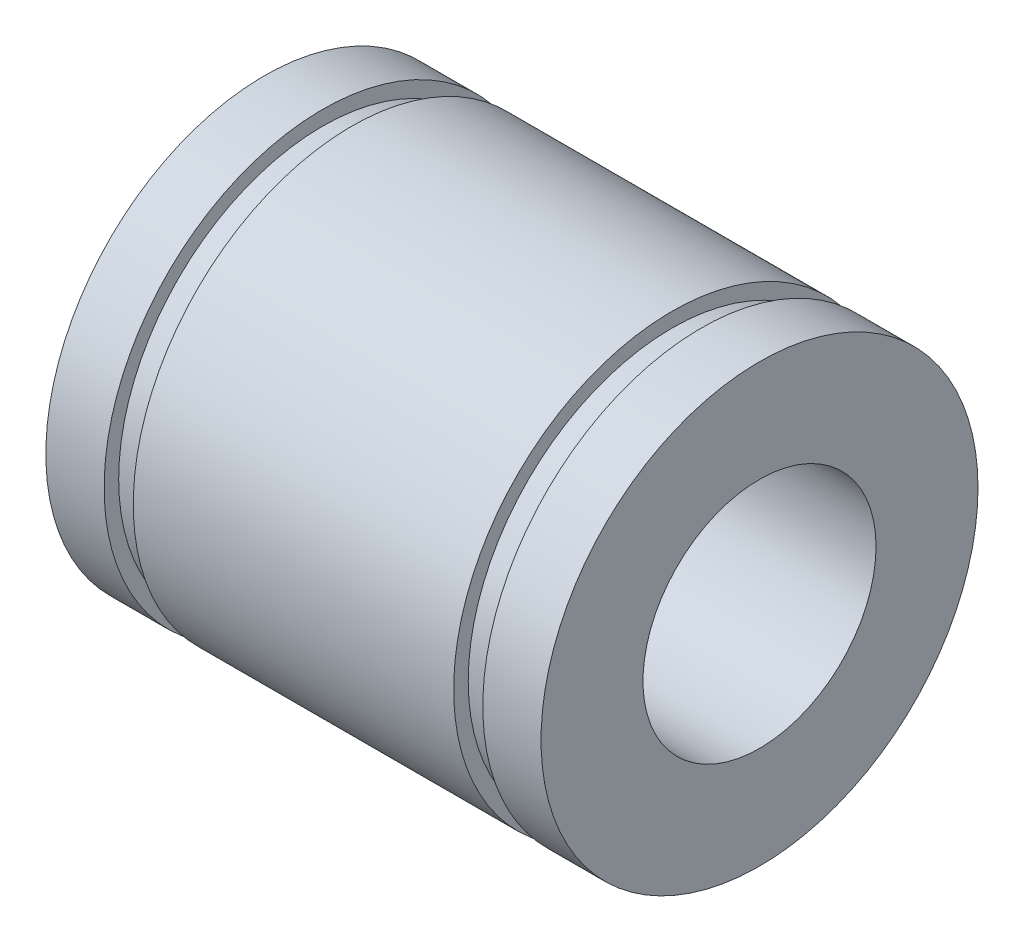
ISO-10303-21;
HEADER;
FILE_DESCRIPTION(('STEP AP214'),'2;1');
FILE_NAME('part.step','',(''),(''),'','','');
FILE_SCHEMA(('AUTOMOTIVE_DESIGN { 1 0 10303 214 1 1 1 1 }'));
ENDSEC;
DATA;
#1=APPLICATION_CONTEXT('core data for automotive mechanical design processes');
#2=APPLICATION_PROTOCOL_DEFINITION('international standard','automotive_design',2000,#1);
#3=PRODUCT_CONTEXT('',#1,'mechanical');
#4=PRODUCT('Part','Part','',(#3));
#5=PRODUCT_RELATED_PRODUCT_CATEGORY('part','',(#4));
#6=PRODUCT_DEFINITION_FORMATION('','',#4);
#7=PRODUCT_DEFINITION_CONTEXT('part definition',#1,'design');
#8=PRODUCT_DEFINITION('design','',#6,#7);
#9=PRODUCT_DEFINITION_SHAPE('','',#8);
#10=(LENGTH_UNIT() NAMED_UNIT(*) SI_UNIT(.MILLI.,.METRE.));
#11=(NAMED_UNIT(*) PLANE_ANGLE_UNIT() SI_UNIT($,.RADIAN.));
#12=(NAMED_UNIT(*) SI_UNIT($,.STERADIAN.) SOLID_ANGLE_UNIT());
#13=UNCERTAINTY_MEASURE_WITH_UNIT(LENGTH_MEASURE(1.E-05),#10,'distance_accuracy_value','');
#14=(GEOMETRIC_REPRESENTATION_CONTEXT(3) GLOBAL_UNCERTAINTY_ASSIGNED_CONTEXT((#13)) GLOBAL_UNIT_ASSIGNED_CONTEXT((#10,
#11,#12)) REPRESENTATION_CONTEXT('',''));
#15=CARTESIAN_POINT('',(0.,0.,0.));
#16=DIRECTION('',(0.,0.,1.));
#17=DIRECTION('',(1.,0.,0.));
#18=AXIS2_PLACEMENT_3D('',#15,#16,#17);
#19=CARTESIAN_POINT('',(14.,0.,0.));
#20=DIRECTION('',(1.,0.,0.));
#21=DIRECTION('',(0.,0.,-1.));
#22=AXIS2_PLACEMENT_3D('',#19,#20,#21);
#23=PLANE('',#22);
#24=CARTESIAN_POINT('',(14.,0.,0.));
#25=DIRECTION('',(1.,0.,0.));
#26=DIRECTION('',(0.,0.,-1.));
#27=AXIS2_PLACEMENT_3D('',#24,#25,#26);
#28=CIRCLE('',#27,7.5);
#29=CARTESIAN_POINT('',(14.,0.,-7.5));
#30=VERTEX_POINT('',#29);
#31=EDGE_CURVE('E49',#30,#30,#28,.T.);
#32=ORIENTED_EDGE('',*,*,#31,.T.);
#33=EDGE_LOOP('',(#32));
#34=FACE_BOUND('',#33,.T.);
#35=CARTESIAN_POINT('',(14.,0.,0.));
#36=DIRECTION('',(1.,0.,0.));
#37=DIRECTION('',(0.,0.,-1.));
#38=AXIS2_PLACEMENT_3D('',#35,#36,#37);
#39=CIRCLE('',#38,7.);
#40=CARTESIAN_POINT('',(14.,0.,-7.));
#41=VERTEX_POINT('',#40);
#42=EDGE_CURVE('E58',#41,#41,#39,.T.);
#43=ORIENTED_EDGE('',*,*,#42,.F.);
#44=EDGE_LOOP('',(#43));
#45=FACE_BOUND('',#44,.T.);
#46=ADVANCED_FACE('F30',(#34,#45),#23,.T.);
#47=CARTESIAN_POINT('',(2.,0.,0.));
#48=DIRECTION('',(1.,0.,0.));
#49=DIRECTION('',(0.,0.,-1.));
#50=AXIS2_PLACEMENT_3D('',#47,#48,#49);
#51=PLANE('',#50);
#52=CARTESIAN_POINT('',(2.,0.,0.));
#53=DIRECTION('',(1.,0.,0.));
#54=DIRECTION('',(0.,0.,-1.));
#55=AXIS2_PLACEMENT_3D('',#52,#53,#54);
#56=CIRCLE('',#55,7.5);
#57=CARTESIAN_POINT('',(2.,0.,-7.5));
#58=VERTEX_POINT('',#57);
#59=EDGE_CURVE('E10',#58,#58,#56,.T.);
#60=ORIENTED_EDGE('',*,*,#59,.T.);
#61=EDGE_LOOP('',(#60));
#62=FACE_BOUND('',#61,.T.);
#63=CARTESIAN_POINT('',(2.,0.,0.));
#64=DIRECTION('',(1.,0.,0.));
#65=DIRECTION('',(0.,0.,-1.));
#66=AXIS2_PLACEMENT_3D('',#63,#64,#65);
#67=CIRCLE('',#66,7.);
#68=CARTESIAN_POINT('',(2.,0.,-7.));
#69=VERTEX_POINT('',#68);
#70=EDGE_CURVE('E46',#69,#69,#67,.T.);
#71=ORIENTED_EDGE('',*,*,#70,.F.);
#72=EDGE_LOOP('',(#71));
#73=FACE_BOUND('',#72,.T.);
#74=ADVANCED_FACE('F91',(#62,#73),#51,.T.);
#75=CARTESIAN_POINT('',(0.,0.,0.));
#76=DIRECTION('',(1.,0.,0.));
#77=DIRECTION('',(0.,0.,-1.));
#78=AXIS2_PLACEMENT_3D('',#75,#76,#77);
#79=PLANE('',#78);
#80=CARTESIAN_POINT('',(0.,0.,0.));
#81=DIRECTION('',(1.,0.,0.));
#82=DIRECTION('',(0.,0.,-1.));
#83=AXIS2_PLACEMENT_3D('',#80,#81,#82);
#84=CIRCLE('',#83,7.5);
#85=CARTESIAN_POINT('',(0.,0.,-7.5));
#86=VERTEX_POINT('',#85);
#87=EDGE_CURVE('E34',#86,#86,#84,.T.);
#88=ORIENTED_EDGE('',*,*,#87,.F.);
#89=EDGE_LOOP('',(#88));
#90=FACE_BOUND('',#89,.T.);
#91=CARTESIAN_POINT('',(0.,0.,0.));
#92=DIRECTION('',(1.,0.,0.));
#93=DIRECTION('',(0.,0.,-1.));
#94=AXIS2_PLACEMENT_3D('',#91,#92,#93);
#95=CIRCLE('',#94,4.);
#96=CARTESIAN_POINT('',(0.,0.,-4.));
#97=VERTEX_POINT('',#96);
#98=EDGE_CURVE('E41',#97,#97,#95,.T.);
#99=ORIENTED_EDGE('',*,*,#98,.T.);
#100=EDGE_LOOP('',(#99));
#101=FACE_BOUND('',#100,.T.);
#102=ADVANCED_FACE('F97',(#90,#101),#79,.F.);
#103=CARTESIAN_POINT('',(2.,0.,0.));
#104=DIRECTION('',(-1.,0.,0.));
#105=DIRECTION('',(0.,0.,1.));
#106=AXIS2_PLACEMENT_3D('',#103,#104,#105);
#107=CYLINDRICAL_SURFACE('',#106,7.5);
#108=ORIENTED_EDGE('',*,*,#59,.F.);
#109=EDGE_LOOP('',(#108));
#110=FACE_BOUND('',#109,.T.);
#111=ORIENTED_EDGE('',*,*,#87,.T.);
#112=EDGE_LOOP('',(#111));
#113=FACE_BOUND('',#112,.T.);
#114=ADVANCED_FACE('F32',(#110,#113),#107,.T.);
#115=CARTESIAN_POINT('',(2.,0.,0.));
#116=DIRECTION('',(-1.,0.,0.));
#117=DIRECTION('',(0.,0.,1.));
#118=AXIS2_PLACEMENT_3D('',#115,#116,#117);
#119=CYLINDRICAL_SURFACE('',#118,4.);
#120=ORIENTED_EDGE('',*,*,#98,.F.);
#121=EDGE_LOOP('',(#120));
#122=FACE_BOUND('',#121,.T.);
#123=CARTESIAN_POINT('',(17.,0.,0.));
#124=DIRECTION('',(1.,0.,0.));
#125=DIRECTION('',(0.,0.,-1.));
#126=AXIS2_PLACEMENT_3D('',#123,#124,#125);
#127=CIRCLE('',#126,4.);
#128=CARTESIAN_POINT('',(17.,0.,-4.));
#129=VERTEX_POINT('',#128);
#130=EDGE_CURVE('E67',#129,#129,#127,.T.);
#131=ORIENTED_EDGE('',*,*,#130,.T.);
#132=EDGE_LOOP('',(#131));
#133=FACE_BOUND('',#132,.T.);
#134=ADVANCED_FACE('F73',(#122,#133),#119,.F.);
#135=CARTESIAN_POINT('',(3.,0.,0.));
#136=DIRECTION('',(-1.,0.,0.));
#137=DIRECTION('',(0.,0.,1.));
#138=AXIS2_PLACEMENT_3D('',#135,#136,#137);
#139=CYLINDRICAL_SURFACE('',#138,7.);
#140=CARTESIAN_POINT('',(3.,0.,0.));
#141=DIRECTION('',(1.,0.,0.));
#142=DIRECTION('',(0.,0.,-1.));
#143=AXIS2_PLACEMENT_3D('',#140,#141,#142);
#144=CIRCLE('',#143,7.);
#145=CARTESIAN_POINT('',(3.,0.,-7.));
#146=VERTEX_POINT('',#145);
#147=EDGE_CURVE('E45',#146,#146,#144,.T.);
#148=ORIENTED_EDGE('',*,*,#147,.F.);
#149=EDGE_LOOP('',(#148));
#150=FACE_BOUND('',#149,.T.);
#151=ORIENTED_EDGE('',*,*,#70,.T.);
#152=EDGE_LOOP('',(#151));
#153=FACE_BOUND('',#152,.T.);
#154=ADVANCED_FACE('F106',(#150,#153),#139,.T.);
#155=CARTESIAN_POINT('',(3.,0.,0.));
#156=DIRECTION('',(1.,0.,0.));
#157=DIRECTION('',(0.,0.,-1.));
#158=AXIS2_PLACEMENT_3D('',#155,#156,#157);
#159=PLANE('',#158);
#160=CARTESIAN_POINT('',(3.,0.,0.));
#161=DIRECTION('',(1.,0.,0.));
#162=DIRECTION('',(0.,0.,-1.));
#163=AXIS2_PLACEMENT_3D('',#160,#161,#162);
#164=CIRCLE('',#163,7.5);
#165=CARTESIAN_POINT('',(3.,0.,-7.5));
#166=VERTEX_POINT('',#165);
#167=EDGE_CURVE('E52',#166,#166,#164,.T.);
#168=ORIENTED_EDGE('',*,*,#167,.F.);
#169=EDGE_LOOP('',(#168));
#170=FACE_BOUND('',#169,.T.);
#171=ORIENTED_EDGE('',*,*,#147,.T.);
#172=EDGE_LOOP('',(#171));
#173=FACE_BOUND('',#172,.T.);
#174=ADVANCED_FACE('F102',(#170,#173),#159,.F.);
#175=CARTESIAN_POINT('',(14.,0.,0.));
#176=DIRECTION('',(-1.,0.,0.));
#177=DIRECTION('',(0.,0.,1.));
#178=AXIS2_PLACEMENT_3D('',#175,#176,#177);
#179=CYLINDRICAL_SURFACE('',#178,7.5);
#180=ORIENTED_EDGE('',*,*,#31,.F.);
#181=EDGE_LOOP('',(#180));
#182=FACE_BOUND('',#181,.T.);
#183=ORIENTED_EDGE('',*,*,#167,.T.);
#184=EDGE_LOOP('',(#183));
#185=FACE_BOUND('',#184,.T.);
#186=ADVANCED_FACE('F105',(#182,#185),#179,.T.);
#187=CARTESIAN_POINT('',(15.,0.,0.));
#188=DIRECTION('',(-1.,0.,0.));
#189=DIRECTION('',(0.,0.,1.));
#190=AXIS2_PLACEMENT_3D('',#187,#188,#189);
#191=CYLINDRICAL_SURFACE('',#190,7.);
#192=CARTESIAN_POINT('',(15.,0.,0.));
#193=DIRECTION('',(1.,0.,0.));
#194=DIRECTION('',(0.,0.,-1.));
#195=AXIS2_PLACEMENT_3D('',#192,#193,#194);
#196=CIRCLE('',#195,7.);
#197=CARTESIAN_POINT('',(15.,0.,-7.));
#198=VERTEX_POINT('',#197);
#199=EDGE_CURVE('E55',#198,#198,#196,.T.);
#200=ORIENTED_EDGE('',*,*,#199,.F.);
#201=EDGE_LOOP('',(#200));
#202=FACE_BOUND('',#201,.T.);
#203=ORIENTED_EDGE('',*,*,#42,.T.);
#204=EDGE_LOOP('',(#203));
#205=FACE_BOUND('',#204,.T.);
#206=ADVANCED_FACE('F87',(#202,#205),#191,.T.);
#207=CARTESIAN_POINT('',(15.,0.,0.));
#208=DIRECTION('',(1.,0.,0.));
#209=DIRECTION('',(0.,0.,-1.));
#210=AXIS2_PLACEMENT_3D('',#207,#208,#209);
#211=PLANE('',#210);
#212=CARTESIAN_POINT('',(15.,0.,0.));
#213=DIRECTION('',(1.,0.,0.));
#214=DIRECTION('',(0.,0.,-1.));
#215=AXIS2_PLACEMENT_3D('',#212,#213,#214);
#216=CIRCLE('',#215,7.5);
#217=CARTESIAN_POINT('',(15.,0.,-7.5));
#218=VERTEX_POINT('',#217);
#219=EDGE_CURVE('E64',#218,#218,#216,.T.);
#220=ORIENTED_EDGE('',*,*,#219,.F.);
#221=EDGE_LOOP('',(#220));
#222=FACE_BOUND('',#221,.T.);
#223=ORIENTED_EDGE('',*,*,#199,.T.);
#224=EDGE_LOOP('',(#223));
#225=FACE_BOUND('',#224,.T.);
#226=ADVANCED_FACE('F78',(#222,#225),#211,.F.);
#227=CARTESIAN_POINT('',(17.,0.,0.));
#228=DIRECTION('',(1.,0.,0.));
#229=DIRECTION('',(0.,0.,-1.));
#230=AXIS2_PLACEMENT_3D('',#227,#228,#229);
#231=PLANE('',#230);
#232=CARTESIAN_POINT('',(17.,0.,0.));
#233=DIRECTION('',(1.,0.,0.));
#234=DIRECTION('',(0.,0.,-1.));
#235=AXIS2_PLACEMENT_3D('',#232,#233,#234);
#236=CIRCLE('',#235,7.5);
#237=CARTESIAN_POINT('',(17.,0.,-7.5));
#238=VERTEX_POINT('',#237);
#239=EDGE_CURVE('E61',#238,#238,#236,.T.);
#240=ORIENTED_EDGE('',*,*,#239,.T.);
#241=EDGE_LOOP('',(#240));
#242=FACE_BOUND('',#241,.T.);
#243=ORIENTED_EDGE('',*,*,#130,.F.);
#244=EDGE_LOOP('',(#243));
#245=FACE_BOUND('',#244,.T.);
#246=ADVANCED_FACE('F75',(#242,#245),#231,.T.);
#247=CARTESIAN_POINT('',(17.,0.,0.));
#248=DIRECTION('',(-1.,0.,0.));
#249=DIRECTION('',(0.,0.,1.));
#250=AXIS2_PLACEMENT_3D('',#247,#248,#249);
#251=CYLINDRICAL_SURFACE('',#250,7.5);
#252=ORIENTED_EDGE('',*,*,#239,.F.);
#253=EDGE_LOOP('',(#252));
#254=FACE_BOUND('',#253,.T.);
#255=ORIENTED_EDGE('',*,*,#219,.T.);
#256=EDGE_LOOP('',(#255));
#257=FACE_BOUND('',#256,.T.);
#258=ADVANCED_FACE('F77',(#254,#257),#251,.T.);
#259=CLOSED_SHELL('',(#46,#74,#102,#114,#134,#154,#174,#186,#206,#226,#246,#258));
#260=MANIFOLD_SOLID_BREP('B2',#259);
#261=ADVANCED_BREP_SHAPE_REPRESENTATION('',(#18,#260),#14);
#262=SHAPE_DEFINITION_REPRESENTATION(#9,#261);
ENDSEC;
END-ISO-10303-21;
